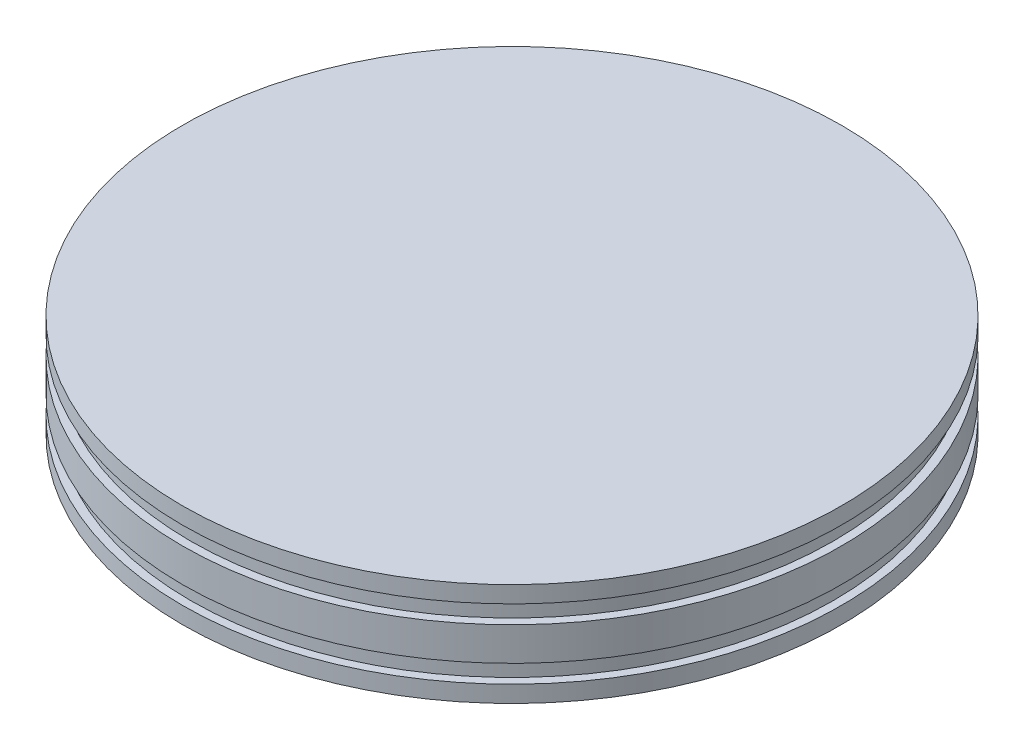
ISO-10303-21;
HEADER;
FILE_DESCRIPTION(('STEP AP214'),'2;1');
FILE_NAME('part.step','',(''),(''),'','','');
FILE_SCHEMA(('AUTOMOTIVE_DESIGN { 1 0 10303 214 1 1 1 1 }'));
ENDSEC;
DATA;
#1=APPLICATION_CONTEXT('core data for automotive mechanical design processes');
#2=APPLICATION_PROTOCOL_DEFINITION('international standard','automotive_design',2000,#1);
#3=PRODUCT_CONTEXT('',#1,'mechanical');
#4=PRODUCT('Part','Part','',(#3));
#5=PRODUCT_RELATED_PRODUCT_CATEGORY('part','',(#4));
#6=PRODUCT_DEFINITION_FORMATION('','',#4);
#7=PRODUCT_DEFINITION_CONTEXT('part definition',#1,'design');
#8=PRODUCT_DEFINITION('design','',#6,#7);
#9=PRODUCT_DEFINITION_SHAPE('','',#8);
#10=(LENGTH_UNIT() NAMED_UNIT(*) SI_UNIT(.MILLI.,.METRE.));
#11=(NAMED_UNIT(*) PLANE_ANGLE_UNIT() SI_UNIT($,.RADIAN.));
#12=(NAMED_UNIT(*) SI_UNIT($,.STERADIAN.) SOLID_ANGLE_UNIT());
#13=UNCERTAINTY_MEASURE_WITH_UNIT(LENGTH_MEASURE(1.E-05),#10,'distance_accuracy_value','');
#14=(GEOMETRIC_REPRESENTATION_CONTEXT(3) GLOBAL_UNCERTAINTY_ASSIGNED_CONTEXT((#13)) GLOBAL_UNIT_ASSIGNED_CONTEXT((#10,
#11,#12)) REPRESENTATION_CONTEXT('',''));
#15=CARTESIAN_POINT('',(0.,0.,0.));
#16=DIRECTION('',(0.,0.,1.));
#17=DIRECTION('',(1.,0.,0.));
#18=AXIS2_PLACEMENT_3D('',#15,#16,#17);
#19=CARTESIAN_POINT('',(0.,20.,0.));
#20=DIRECTION('',(0.,-1.,0.));
#21=DIRECTION('',(0.,0.,-1.));
#22=AXIS2_PLACEMENT_3D('',#19,#20,#21);
#23=CYLINDRICAL_SURFACE('',#22,64.);
#24=CARTESIAN_POINT('',(0.,16.75,0.));
#25=DIRECTION('',(0.,-1.,0.));
#26=DIRECTION('',(0.,0.,-1.));
#27=AXIS2_PLACEMENT_3D('',#24,#25,#26);
#28=CIRCLE('',#27,64.);
#29=CARTESIAN_POINT('',(0.,16.75,-64.));
#30=VERTEX_POINT('',#29);
#31=EDGE_CURVE('E85',#30,#30,#28,.T.);
#32=ORIENTED_EDGE('',*,*,#31,.F.);
#33=EDGE_LOOP('',(#32));
#34=FACE_BOUND('',#33,.T.);
#35=CARTESIAN_POINT('',(0.,20.,0.));
#36=DIRECTION('',(0.,1.,0.));
#37=DIRECTION('',(0.,0.,1.));
#38=AXIS2_PLACEMENT_3D('',#35,#36,#37);
#39=CIRCLE('',#38,64.);
#40=CARTESIAN_POINT('',(0.,20.,64.));
#41=VERTEX_POINT('',#40);
#42=EDGE_CURVE('E10',#41,#41,#39,.T.);
#43=ORIENTED_EDGE('',*,*,#42,.F.);
#44=EDGE_LOOP('',(#43));
#45=FACE_BOUND('',#44,.T.);
#46=ADVANCED_FACE('F46',(#34,#45),#23,.T.);
#47=CARTESIAN_POINT('',(0.,20.,0.));
#48=DIRECTION('',(0.,1.,0.));
#49=DIRECTION('',(0.,0.,1.));
#50=AXIS2_PLACEMENT_3D('',#47,#48,#49);
#51=PLANE('',#50);
#52=ORIENTED_EDGE('',*,*,#42,.T.);
#53=EDGE_LOOP('',(#52));
#54=FACE_BOUND('',#53,.T.);
#55=ADVANCED_FACE('F99',(#54),#51,.T.);
#56=CARTESIAN_POINT('',(0.,13.25,0.));
#57=DIRECTION('',(0.,1.,0.));
#58=DIRECTION('',(0.,0.,1.));
#59=AXIS2_PLACEMENT_3D('',#56,#57,#58);
#60=PLANE('',#59);
#61=CARTESIAN_POINT('',(0.,13.25,0.));
#62=DIRECTION('',(0.,-1.,0.));
#63=DIRECTION('',(0.,0.,-1.));
#64=AXIS2_PLACEMENT_3D('',#61,#62,#63);
#65=CIRCLE('',#64,62.4);
#66=CARTESIAN_POINT('',(0.,13.25,-62.4));
#67=VERTEX_POINT('',#66);
#68=EDGE_CURVE('E59',#67,#67,#65,.T.);
#69=ORIENTED_EDGE('',*,*,#68,.T.);
#70=EDGE_LOOP('',(#69));
#71=FACE_BOUND('',#70,.T.);
#72=CARTESIAN_POINT('',(0.,13.25,0.));
#73=DIRECTION('',(0.,-1.,0.));
#74=DIRECTION('',(0.,0.,-1.));
#75=AXIS2_PLACEMENT_3D('',#72,#73,#74);
#76=CIRCLE('',#75,64.);
#77=CARTESIAN_POINT('',(0.,13.25,-64.));
#78=VERTEX_POINT('',#77);
#79=EDGE_CURVE('E65',#78,#78,#76,.T.);
#80=ORIENTED_EDGE('',*,*,#79,.F.);
#81=EDGE_LOOP('',(#80));
#82=FACE_BOUND('',#81,.T.);
#83=ADVANCED_FACE('F96',(#71,#82),#60,.T.);
#84=CARTESIAN_POINT('',(0.,0.,0.));
#85=DIRECTION('',(0.,-1.,0.));
#86=DIRECTION('',(0.,0.,-1.));
#87=AXIS2_PLACEMENT_3D('',#84,#85,#86);
#88=CYLINDRICAL_SURFACE('',#87,62.4);
#89=CARTESIAN_POINT('',(0.,16.75,0.));
#90=DIRECTION('',(0.,-1.,0.));
#91=DIRECTION('',(0.,0.,-1.));
#92=AXIS2_PLACEMENT_3D('',#89,#90,#91);
#93=CIRCLE('',#92,62.4);
#94=CARTESIAN_POINT('',(0.,16.75,-62.4));
#95=VERTEX_POINT('',#94);
#96=EDGE_CURVE('E81',#95,#95,#93,.T.);
#97=ORIENTED_EDGE('',*,*,#96,.T.);
#98=EDGE_LOOP('',(#97));
#99=FACE_BOUND('',#98,.T.);
#100=ORIENTED_EDGE('',*,*,#68,.F.);
#101=EDGE_LOOP('',(#100));
#102=FACE_BOUND('',#101,.T.);
#103=ADVANCED_FACE('F98',(#99,#102),#88,.T.);
#104=CARTESIAN_POINT('',(0.,16.75,0.));
#105=DIRECTION('',(0.,1.,0.));
#106=DIRECTION('',(0.,0.,1.));
#107=AXIS2_PLACEMENT_3D('',#104,#105,#106);
#108=PLANE('',#107);
#109=ORIENTED_EDGE('',*,*,#96,.F.);
#110=EDGE_LOOP('',(#109));
#111=FACE_BOUND('',#110,.T.);
#112=ORIENTED_EDGE('',*,*,#31,.T.);
#113=EDGE_LOOP('',(#112));
#114=FACE_BOUND('',#113,.T.);
#115=ADVANCED_FACE('F106',(#111,#114),#108,.F.);
#116=CARTESIAN_POINT('',(0.,6.75000000000002,0.));
#117=DIRECTION('',(0.,-1.,0.));
#118=DIRECTION('',(0.,0.,-1.));
#119=AXIS2_PLACEMENT_3D('',#116,#117,#118);
#120=CIRCLE('',#119,64.);
#121=CARTESIAN_POINT('',(0.,6.75000000000002,-64.));
#122=VERTEX_POINT('',#121);
#123=EDGE_CURVE('E66',#122,#122,#120,.T.);
#124=ORIENTED_EDGE('',*,*,#123,.F.);
#125=EDGE_LOOP('',(#124));
#126=FACE_BOUND('',#125,.T.);
#127=ORIENTED_EDGE('',*,*,#79,.T.);
#128=EDGE_LOOP('',(#127));
#129=FACE_BOUND('',#128,.T.);
#130=ADVANCED_FACE('F94',(#126,#129),#23,.T.);
#131=CARTESIAN_POINT('',(0.,3.25000000000002,64.));
#132=DIRECTION('',(0.,1.,0.));
#133=DIRECTION('',(0.,0.,1.));
#134=AXIS2_PLACEMENT_3D('',#131,#132,#133);
#135=PLANE('',#134);
#136=CARTESIAN_POINT('',(0.,3.25000000000002,0.));
#137=DIRECTION('',(0.,-1.,0.));
#138=DIRECTION('',(0.,0.,-1.));
#139=AXIS2_PLACEMENT_3D('',#136,#137,#138);
#140=CIRCLE('',#139,62.4);
#141=CARTESIAN_POINT('',(0.,3.25000000000002,-62.4));
#142=VERTEX_POINT('',#141);
#143=EDGE_CURVE('E74',#142,#142,#140,.T.);
#144=ORIENTED_EDGE('',*,*,#143,.T.);
#145=EDGE_LOOP('',(#144));
#146=FACE_BOUND('',#145,.T.);
#147=CARTESIAN_POINT('',(0.,3.25000000000002,0.));
#148=DIRECTION('',(0.,-1.,0.));
#149=DIRECTION('',(0.,0.,-1.));
#150=AXIS2_PLACEMENT_3D('',#147,#148,#149);
#151=CIRCLE('',#150,64.);
#152=CARTESIAN_POINT('',(0.,3.25000000000002,-64.));
#153=VERTEX_POINT('',#152);
#154=EDGE_CURVE('E61',#153,#153,#151,.T.);
#155=ORIENTED_EDGE('',*,*,#154,.F.);
#156=EDGE_LOOP('',(#155));
#157=FACE_BOUND('',#156,.T.);
#158=ADVANCED_FACE('F119',(#146,#157),#135,.T.);
#159=CARTESIAN_POINT('',(0.,0.,0.));
#160=DIRECTION('',(0.,-1.,0.));
#161=DIRECTION('',(0.,0.,-1.));
#162=AXIS2_PLACEMENT_3D('',#159,#160,#161);
#163=CYLINDRICAL_SURFACE('',#162,62.4);
#164=CARTESIAN_POINT('',(0.,6.75000000000002,0.));
#165=DIRECTION('',(0.,-1.,0.));
#166=DIRECTION('',(0.,0.,-1.));
#167=AXIS2_PLACEMENT_3D('',#164,#165,#166);
#168=CIRCLE('',#167,62.4);
#169=CARTESIAN_POINT('',(0.,6.75000000000002,-62.4));
#170=VERTEX_POINT('',#169);
#171=EDGE_CURVE('E70',#170,#170,#168,.T.);
#172=ORIENTED_EDGE('',*,*,#171,.T.);
#173=EDGE_LOOP('',(#172));
#174=FACE_BOUND('',#173,.T.);
#175=ORIENTED_EDGE('',*,*,#143,.F.);
#176=EDGE_LOOP('',(#175));
#177=FACE_BOUND('',#176,.T.);
#178=ADVANCED_FACE('F134',(#174,#177),#163,.T.);
#179=CARTESIAN_POINT('',(0.,6.75000000000002,64.));
#180=DIRECTION('',(0.,1.,0.));
#181=DIRECTION('',(0.,0.,1.));
#182=AXIS2_PLACEMENT_3D('',#179,#180,#181);
#183=PLANE('',#182);
#184=ORIENTED_EDGE('',*,*,#171,.F.);
#185=EDGE_LOOP('',(#184));
#186=FACE_BOUND('',#185,.T.);
#187=ORIENTED_EDGE('',*,*,#123,.T.);
#188=EDGE_LOOP('',(#187));
#189=FACE_BOUND('',#188,.T.);
#190=ADVANCED_FACE('F127',(#186,#189),#183,.F.);
#191=CARTESIAN_POINT('',(0.,0.,0.));
#192=DIRECTION('',(0.,1.,0.));
#193=DIRECTION('',(0.,0.,1.));
#194=AXIS2_PLACEMENT_3D('',#191,#192,#193);
#195=PLANE('',#194);
#196=CARTESIAN_POINT('',(0.,0.,0.));
#197=DIRECTION('',(0.,1.,0.));
#198=DIRECTION('',(0.,0.,1.));
#199=AXIS2_PLACEMENT_3D('',#196,#197,#198);
#200=CIRCLE('',#199,64.);
#201=CARTESIAN_POINT('',(0.,0.,64.));
#202=VERTEX_POINT('',#201);
#203=EDGE_CURVE('E49',#202,#202,#200,.T.);
#204=ORIENTED_EDGE('',*,*,#203,.F.);
#205=EDGE_LOOP('',(#204));
#206=FACE_BOUND('',#205,.T.);
#207=ADVANCED_FACE('F122',(#206),#195,.F.);
#208=ORIENTED_EDGE('',*,*,#203,.T.);
#209=EDGE_LOOP('',(#208));
#210=FACE_BOUND('',#209,.T.);
#211=ORIENTED_EDGE('',*,*,#154,.T.);
#212=EDGE_LOOP('',(#211));
#213=FACE_BOUND('',#212,.T.);
#214=ADVANCED_FACE('F113',(#210,#213),#23,.T.);
#215=CLOSED_SHELL('',(#46,#55,#83,#103,#115,#130,#158,#178,#190,#207,#214));
#216=MANIFOLD_SOLID_BREP('B2',#215);
#217=ADVANCED_BREP_SHAPE_REPRESENTATION('',(#18,#216),#14);
#218=SHAPE_DEFINITION_REPRESENTATION(#9,#217);
ENDSEC;
END-ISO-10303-21;
